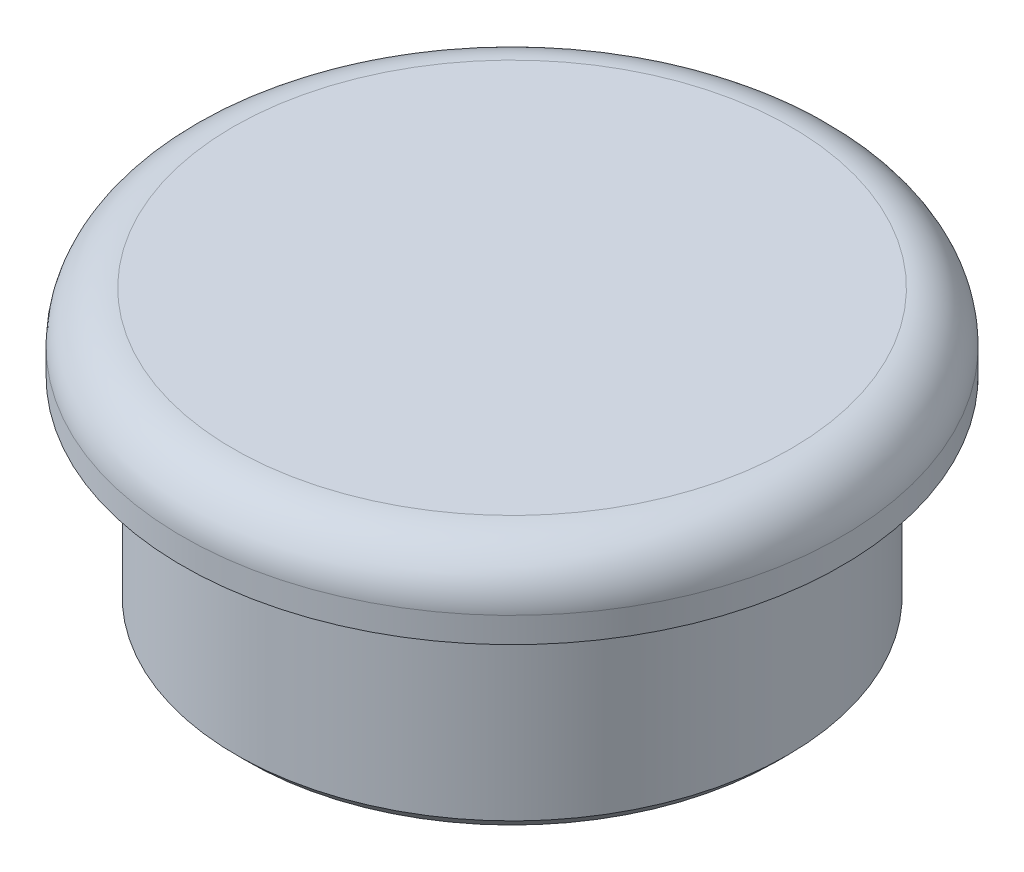
ISO-10303-21;
HEADER;
FILE_DESCRIPTION(('STEP AP214'),'2;1');
FILE_NAME('part.step','',(''),(''),'','','');
FILE_SCHEMA(('AUTOMOTIVE_DESIGN { 1 0 10303 214 1 1 1 1 }'));
ENDSEC;
DATA;
#1=APPLICATION_CONTEXT('core data for automotive mechanical design processes');
#2=APPLICATION_PROTOCOL_DEFINITION('international standard','automotive_design',2000,#1);
#3=PRODUCT_CONTEXT('',#1,'mechanical');
#4=PRODUCT('Part','Part','',(#3));
#5=PRODUCT_RELATED_PRODUCT_CATEGORY('part','',(#4));
#6=PRODUCT_DEFINITION_FORMATION('','',#4);
#7=PRODUCT_DEFINITION_CONTEXT('part definition',#1,'design');
#8=PRODUCT_DEFINITION('design','',#6,#7);
#9=PRODUCT_DEFINITION_SHAPE('','',#8);
#10=(LENGTH_UNIT() NAMED_UNIT(*) SI_UNIT(.MILLI.,.METRE.));
#11=(NAMED_UNIT(*) PLANE_ANGLE_UNIT() SI_UNIT($,.RADIAN.));
#12=(NAMED_UNIT(*) SI_UNIT($,.STERADIAN.) SOLID_ANGLE_UNIT());
#13=UNCERTAINTY_MEASURE_WITH_UNIT(LENGTH_MEASURE(1.E-05),#10,'distance_accuracy_value','');
#14=(GEOMETRIC_REPRESENTATION_CONTEXT(3) GLOBAL_UNCERTAINTY_ASSIGNED_CONTEXT((#13)) GLOBAL_UNIT_ASSIGNED_CONTEXT((#10,
#11,#12)) REPRESENTATION_CONTEXT('',''));
#15=CARTESIAN_POINT('',(0.,0.,0.));
#16=DIRECTION('',(0.,0.,1.));
#17=DIRECTION('',(1.,0.,0.));
#18=AXIS2_PLACEMENT_3D('',#15,#16,#17);
#19=CARTESIAN_POINT('',(-13.9915254237288,22.5433968926554,0.));
#20=DIRECTION('',(0.,1.,0.));
#21=DIRECTION('',(-1.,0.,0.));
#22=AXIS2_PLACEMENT_3D('',#19,#20,#21);
#23=CYLINDRICAL_SURFACE('',#22,20.6375);
#24=CARTESIAN_POINT('',(-13.9915254237288,19.3683968926554,0.));
#25=DIRECTION('',(0.,1.,0.));
#26=DIRECTION('',(-1.,0.,0.));
#27=AXIS2_PLACEMENT_3D('',#24,#25,#26);
#28=CIRCLE('',#27,20.6375);
#29=CARTESIAN_POINT('',(-34.6290254237288,19.3683968926554,0.));
#30=VERTEX_POINT('',#29);
#31=EDGE_CURVE('E70',#30,#30,#28,.F.);
#32=ORIENTED_EDGE('',*,*,#31,.T.);
#33=EDGE_LOOP('',(#32));
#34=FACE_BOUND('',#33,.T.);
#35=CARTESIAN_POINT('',(-13.9915254237288,17.7808968926554,0.));
#36=DIRECTION('',(0.,1.,0.));
#37=DIRECTION('',(-1.,0.,0.));
#38=AXIS2_PLACEMENT_3D('',#35,#36,#37);
#39=CIRCLE('',#38,20.6375);
#40=CARTESIAN_POINT('',(-34.6290254237288,17.7808968926554,0.));
#41=VERTEX_POINT('',#40);
#42=EDGE_CURVE('E82',#41,#41,#39,.T.);
#43=ORIENTED_EDGE('',*,*,#42,.T.);
#44=EDGE_LOOP('',(#43));
#45=FACE_BOUND('',#44,.T.);
#46=ADVANCED_FACE('F38',(#34,#45),#23,.T.);
#47=CARTESIAN_POINT('',(-34.6290254237288,22.5433968926554,0.));
#48=DIRECTION('',(0.,1.,0.));
#49=DIRECTION('',(-1.,0.,0.));
#50=AXIS2_PLACEMENT_3D('',#47,#48,#49);
#51=PLANE('',#50);
#52=CARTESIAN_POINT('',(-13.9915254237288,22.5433968926554,0.));
#53=DIRECTION('',(0.,1.,0.));
#54=DIRECTION('',(-1.,0.,0.));
#55=AXIS2_PLACEMENT_3D('',#52,#53,#54);
#56=CIRCLE('',#55,17.4625);
#57=CARTESIAN_POINT('',(-31.4540254237288,22.5433968926554,0.));
#58=VERTEX_POINT('',#57);
#59=EDGE_CURVE('E74',#58,#58,#56,.T.);
#60=ORIENTED_EDGE('',*,*,#59,.T.);
#61=EDGE_LOOP('',(#60));
#62=FACE_BOUND('',#61,.T.);
#63=ADVANCED_FACE('F105',(#62),#51,.T.);
#64=CARTESIAN_POINT('',(-13.9915254237288,17.7808968926554,0.));
#65=DIRECTION('',(0.,-1.,0.));
#66=DIRECTION('',(1.,0.,0.));
#67=AXIS2_PLACEMENT_3D('',#64,#65,#66);
#68=PLANE('',#67);
#69=CARTESIAN_POINT('',(-13.9915254237288,17.7808968926554,0.));
#70=DIRECTION('',(0.,-1.,0.));
#71=DIRECTION('',(1.,0.,0.));
#72=AXIS2_PLACEMENT_3D('',#69,#70,#71);
#73=CIRCLE('',#72,12.446);
#74=CARTESIAN_POINT('',(-1.54552542372884,17.7808968926554,0.));
#75=VERTEX_POINT('',#74);
#76=EDGE_CURVE('E10',#75,#75,#73,.T.);
#77=ORIENTED_EDGE('',*,*,#76,.T.);
#78=EDGE_LOOP('',(#77));
#79=FACE_BOUND('',#78,.T.);
#80=ADVANCED_FACE('F111',(#79),#68,.T.);
#81=CARTESIAN_POINT('',(-13.9915254237288,22.5433968926554,0.));
#82=DIRECTION('',(0.,1.,0.));
#83=DIRECTION('',(-1.,0.,0.));
#84=AXIS2_PLACEMENT_3D('',#81,#82,#83);
#85=CYLINDRICAL_SURFACE('',#84,14.986);
#86=CARTESIAN_POINT('',(-13.9915254237288,15.2408968926554,0.));
#87=DIRECTION('',(0.,-1.,0.));
#88=DIRECTION('',(1.,0.,0.));
#89=AXIS2_PLACEMENT_3D('',#86,#87,#88);
#90=CIRCLE('',#89,14.986);
#91=CARTESIAN_POINT('',(0.994474576271161,15.2408968926554,0.));
#92=VERTEX_POINT('',#91);
#93=EDGE_CURVE('E46',#92,#92,#90,.F.);
#94=ORIENTED_EDGE('',*,*,#93,.T.);
#95=EDGE_LOOP('',(#94));
#96=FACE_BOUND('',#95,.T.);
#97=CARTESIAN_POINT('',(-13.9915254237288,5.08089689265537,0.));
#98=DIRECTION('',(0.,1.,0.));
#99=DIRECTION('',(-1.,0.,0.));
#100=AXIS2_PLACEMENT_3D('',#97,#98,#99);
#101=CIRCLE('',#100,14.986);
#102=CARTESIAN_POINT('',(-28.9775254237288,5.08089689265537,0.));
#103=VERTEX_POINT('',#102);
#104=EDGE_CURVE('E78',#103,#103,#101,.T.);
#105=ORIENTED_EDGE('',*,*,#104,.F.);
#106=EDGE_LOOP('',(#105));
#107=FACE_BOUND('',#106,.T.);
#108=ADVANCED_FACE('F138',(#96,#107),#85,.F.);
#109=CARTESIAN_POINT('',(-28.9775254237288,5.08089689265537,0.));
#110=DIRECTION('',(0.,-1.,0.));
#111=DIRECTION('',(1.,0.,0.));
#112=AXIS2_PLACEMENT_3D('',#109,#110,#111);
#113=PLANE('',#112);
#114=CARTESIAN_POINT('',(-13.9915254237288,5.08089689265537,0.));
#115=DIRECTION('',(0.,-1.,0.));
#116=DIRECTION('',(1.,0.,0.));
#117=AXIS2_PLACEMENT_3D('',#114,#115,#116);
#118=CIRCLE('',#117,16.51);
#119=CARTESIAN_POINT('',(2.51847457627117,5.08089689265536,0.));
#120=VERTEX_POINT('',#119);
#121=EDGE_CURVE('E51',#120,#120,#118,.T.);
#122=ORIENTED_EDGE('',*,*,#121,.T.);
#123=EDGE_LOOP('',(#122));
#124=FACE_BOUND('',#123,.T.);
#125=ORIENTED_EDGE('',*,*,#104,.T.);
#126=EDGE_LOOP('',(#125));
#127=FACE_BOUND('',#126,.T.);
#128=ADVANCED_FACE('F101',(#124,#127),#113,.T.);
#129=CARTESIAN_POINT('',(-13.9915254237288,22.5433968926554,0.));
#130=DIRECTION('',(0.,1.,0.));
#131=DIRECTION('',(-1.,0.,0.));
#132=AXIS2_PLACEMENT_3D('',#129,#130,#131);
#133=CYLINDRICAL_SURFACE('',#132,17.272);
#134=CARTESIAN_POINT('',(-13.9915254237288,17.0188968926554,0.));
#135=DIRECTION('',(0.,-1.,0.));
#136=DIRECTION('',(0.,0.,-1.));
#137=AXIS2_PLACEMENT_3D('',#134,#135,#136);
#138=CIRCLE('',#137,17.272);
#139=CARTESIAN_POINT('',(-13.9915254237288,17.0188968926554,-17.272));
#140=VERTEX_POINT('',#139);
#141=EDGE_CURVE('E56',#140,#140,#138,.T.);
#142=ORIENTED_EDGE('',*,*,#141,.T.);
#143=EDGE_LOOP('',(#142));
#144=FACE_BOUND('',#143,.T.);
#145=CARTESIAN_POINT('',(-13.9915254237288,5.84289689265537,0.));
#146=DIRECTION('',(0.,-1.,0.));
#147=DIRECTION('',(0.,0.,-1.));
#148=AXIS2_PLACEMENT_3D('',#145,#146,#147);
#149=CIRCLE('',#148,17.272);
#150=CARTESIAN_POINT('',(-13.9915254237288,5.84289689265537,-17.272));
#151=VERTEX_POINT('',#150);
#152=EDGE_CURVE('E62',#151,#151,#149,.F.);
#153=ORIENTED_EDGE('',*,*,#152,.T.);
#154=EDGE_LOOP('',(#153));
#155=FACE_BOUND('',#154,.T.);
#156=ADVANCED_FACE('F91',(#144,#155),#133,.T.);
#157=CARTESIAN_POINT('',(-31.2635254237288,17.7808968926554,0.));
#158=DIRECTION('',(0.,-1.,0.));
#159=DIRECTION('',(1.,0.,0.));
#160=AXIS2_PLACEMENT_3D('',#157,#158,#159);
#161=PLANE('',#160);
#162=CARTESIAN_POINT('',(-13.9915254237288,17.7808968926554,0.));
#163=DIRECTION('',(0.,-1.,0.));
#164=DIRECTION('',(1.,0.,0.));
#165=AXIS2_PLACEMENT_3D('',#162,#163,#164);
#166=CIRCLE('',#165,18.034);
#167=CARTESIAN_POINT('',(4.04247457627119,17.7808968926554,0.));
#168=VERTEX_POINT('',#167);
#169=EDGE_CURVE('E66',#168,#168,#166,.F.);
#170=ORIENTED_EDGE('',*,*,#169,.T.);
#171=EDGE_LOOP('',(#170));
#172=FACE_BOUND('',#171,.T.);
#173=ORIENTED_EDGE('',*,*,#42,.F.);
#174=EDGE_LOOP('',(#173));
#175=FACE_BOUND('',#174,.T.);
#176=ADVANCED_FACE('F88',(#172,#175),#161,.T.);
#177=CARTESIAN_POINT('',(-13.9915254237288,19.3683968926554,0.));
#178=DIRECTION('',(0.,1.,0.));
#179=DIRECTION('',(-1.,0.,0.));
#180=AXIS2_PLACEMENT_3D('',#177,#178,#179);
#181=TOROIDAL_SURFACE('',#180,17.4625,3.175);
#182=ORIENTED_EDGE('',*,*,#31,.F.);
#183=EDGE_LOOP('',(#182));
#184=FACE_BOUND('',#183,.T.);
#185=ORIENTED_EDGE('',*,*,#59,.F.);
#186=EDGE_LOOP('',(#185));
#187=FACE_BOUND('',#186,.T.);
#188=ADVANCED_FACE('F90',(#184,#187),#181,.T.);
#189=CARTESIAN_POINT('',(-13.9915254237288,17.7808968926554,0.));
#190=DIRECTION('',(0.,1.,0.));
#191=DIRECTION('',(0.,0.,1.));
#192=AXIS2_PLACEMENT_3D('',#189,#190,#191);
#193=CONICAL_SURFACE('',#192,18.034,0.785398163397457);
#194=ORIENTED_EDGE('',*,*,#141,.F.);
#195=EDGE_LOOP('',(#194));
#196=FACE_BOUND('',#195,.T.);
#197=ORIENTED_EDGE('',*,*,#169,.F.);
#198=EDGE_LOOP('',(#197));
#199=FACE_BOUND('',#198,.T.);
#200=ADVANCED_FACE('F98',(#196,#199),#193,.T.);
#201=CARTESIAN_POINT('',(-13.9915254237288,5.84289689265537,0.));
#202=DIRECTION('',(0.,1.,0.));
#203=DIRECTION('',(0.,0.,1.));
#204=AXIS2_PLACEMENT_3D('',#201,#202,#203);
#205=CONICAL_SURFACE('',#204,17.272,0.785398163397448);
#206=ORIENTED_EDGE('',*,*,#121,.F.);
#207=EDGE_LOOP('',(#206));
#208=FACE_BOUND('',#207,.T.);
#209=ORIENTED_EDGE('',*,*,#152,.F.);
#210=EDGE_LOOP('',(#209));
#211=FACE_BOUND('',#210,.T.);
#212=ADVANCED_FACE('F121',(#208,#211),#205,.T.);
#213=CARTESIAN_POINT('',(-13.9915254237288,15.2408968926554,0.));
#214=DIRECTION('',(0.,-1.,0.));
#215=DIRECTION('',(1.,0.,0.));
#216=AXIS2_PLACEMENT_3D('',#213,#214,#215);
#217=TOROIDAL_SURFACE('',#216,12.446,2.54);
#218=ORIENTED_EDGE('',*,*,#76,.F.);
#219=EDGE_LOOP('',(#218));
#220=FACE_BOUND('',#219,.T.);
#221=ORIENTED_EDGE('',*,*,#93,.F.);
#222=EDGE_LOOP('',(#221));
#223=FACE_BOUND('',#222,.T.);
#224=ADVANCED_FACE('F40',(#220,#223),#217,.F.);
#225=CLOSED_SHELL('',(#46,#63,#80,#108,#128,#156,#176,#188,#200,#212,#224));
#226=MANIFOLD_SOLID_BREP('B2',#225);
#227=ADVANCED_BREP_SHAPE_REPRESENTATION('',(#18,#226),#14);
#228=SHAPE_DEFINITION_REPRESENTATION(#9,#227);
ENDSEC;
END-ISO-10303-21;
